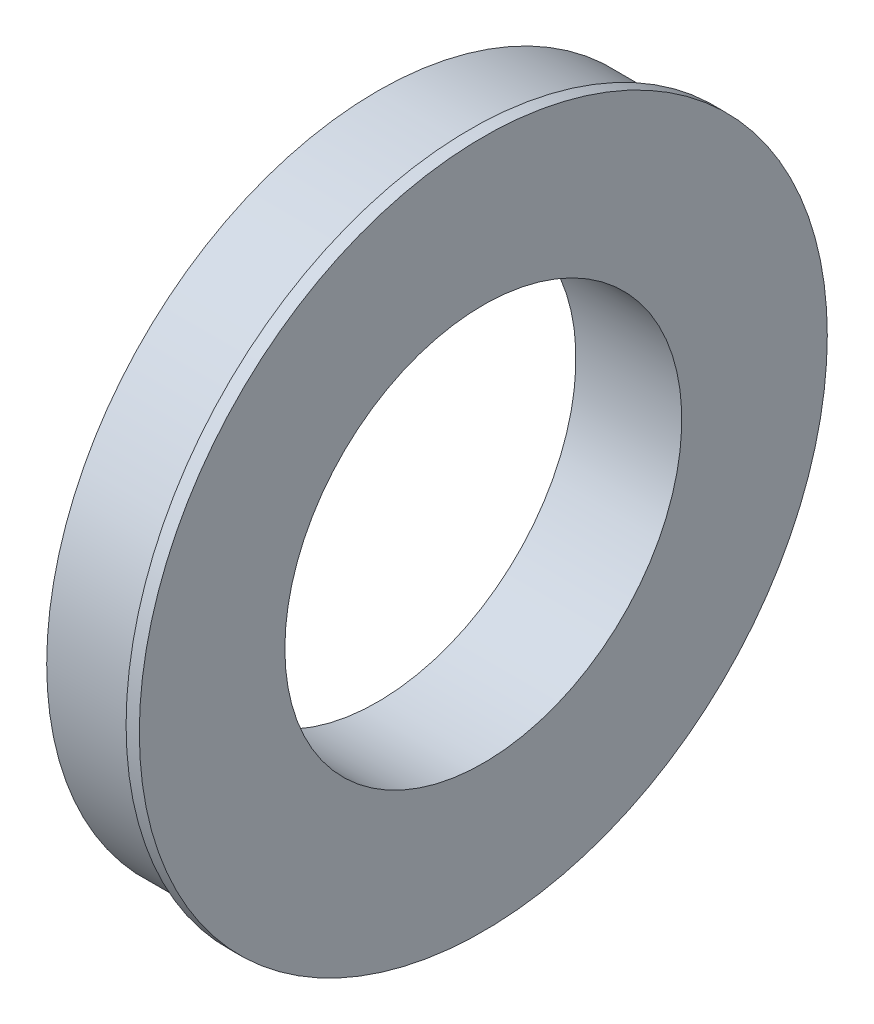
ISO-10303-21;
HEADER;
FILE_DESCRIPTION(('STEP AP214'),'2;1');
FILE_NAME('part.step','',(''),(''),'','','');
FILE_SCHEMA(('AUTOMOTIVE_DESIGN { 1 0 10303 214 1 1 1 1 }'));
ENDSEC;
DATA;
#1=APPLICATION_CONTEXT('core data for automotive mechanical design processes');
#2=APPLICATION_PROTOCOL_DEFINITION('international standard','automotive_design',2000,#1);
#3=PRODUCT_CONTEXT('',#1,'mechanical');
#4=PRODUCT('Part','Part','',(#3));
#5=PRODUCT_RELATED_PRODUCT_CATEGORY('part','',(#4));
#6=PRODUCT_DEFINITION_FORMATION('','',#4);
#7=PRODUCT_DEFINITION_CONTEXT('part definition',#1,'design');
#8=PRODUCT_DEFINITION('design','',#6,#7);
#9=PRODUCT_DEFINITION_SHAPE('','',#8);
#10=(LENGTH_UNIT() NAMED_UNIT(*) SI_UNIT(.MILLI.,.METRE.));
#11=(NAMED_UNIT(*) PLANE_ANGLE_UNIT() SI_UNIT($,.RADIAN.));
#12=(NAMED_UNIT(*) SI_UNIT($,.STERADIAN.) SOLID_ANGLE_UNIT());
#13=UNCERTAINTY_MEASURE_WITH_UNIT(LENGTH_MEASURE(1.E-05),#10,'distance_accuracy_value','');
#14=(GEOMETRIC_REPRESENTATION_CONTEXT(3) GLOBAL_UNCERTAINTY_ASSIGNED_CONTEXT((#13)) GLOBAL_UNIT_ASSIGNED_CONTEXT((#10,
#11,#12)) REPRESENTATION_CONTEXT('',''));
#15=CARTESIAN_POINT('',(0.,0.,0.));
#16=DIRECTION('',(0.,0.,1.));
#17=DIRECTION('',(1.,0.,0.));
#18=AXIS2_PLACEMENT_3D('',#15,#16,#17);
#19=CARTESIAN_POINT('',(9.525,0.,0.));
#20=DIRECTION('',(-1.,0.,0.));
#21=DIRECTION('',(0.,0.,1.));
#22=AXIS2_PLACEMENT_3D('',#19,#20,#21);
#23=CYLINDRICAL_SURFACE('',#22,63.5);
#24=CARTESIAN_POINT('',(-9.525,0.,0.));
#25=DIRECTION('',(1.,0.,0.));
#26=DIRECTION('',(0.,0.,-1.));
#27=AXIS2_PLACEMENT_3D('',#24,#25,#26);
#28=CIRCLE('',#27,63.5);
#29=CARTESIAN_POINT('',(-9.525,0.,63.5));
#30=VERTEX_POINT('',#29);
#31=EDGE_CURVE('E43',#30,#30,#28,.T.);
#32=CARTESIAN_POINT('',(8.255,0.,0.));
#33=DIRECTION('',(1.,0.,0.));
#34=DIRECTION('',(0.,0.,-1.));
#35=AXIS2_PLACEMENT_3D('',#32,#33,#34);
#36=CIRCLE('',#35,63.5);
#37=CARTESIAN_POINT('',(8.255,0.,63.5));
#38=VERTEX_POINT('',#37);
#39=EDGE_CURVE('E10',#38,#38,#36,.T.);
#40=CARTESIAN_POINT('',(-9.525,0.,63.5));
#41=CARTESIAN_POINT('',(-9.33979166666667,0.,63.5));
#42=CARTESIAN_POINT('',(-9.15458333333333,0.,63.5));
#43=CARTESIAN_POINT('',(-8.78416666666667,0.,63.5));
#44=CARTESIAN_POINT('',(-8.59895833333333,0.,63.5));
#45=CARTESIAN_POINT('',(-8.22854166666666,0.,63.5));
#46=CARTESIAN_POINT('',(-8.04333333333333,0.,63.5));
#47=CARTESIAN_POINT('',(-7.67291666666667,0.,63.5));
#48=CARTESIAN_POINT('',(-7.48770833333333,0.,63.5));
#49=CARTESIAN_POINT('',(-7.11729166666667,0.,63.5));
#50=CARTESIAN_POINT('',(-6.93208333333333,0.,63.5));
#51=CARTESIAN_POINT('',(-6.56166666666667,0.,63.5));
#52=CARTESIAN_POINT('',(-6.37645833333333,0.,63.5));
#53=CARTESIAN_POINT('',(-6.00604166666667,0.,63.5));
#54=CARTESIAN_POINT('',(-5.82083333333333,0.,63.5));
#55=CARTESIAN_POINT('',(-5.45041666666667,0.,63.5));
#56=CARTESIAN_POINT('',(-5.26520833333333,0.,63.5));
#57=CARTESIAN_POINT('',(-4.89479166666667,0.,63.5));
#58=CARTESIAN_POINT('',(-4.70958333333333,0.,63.5));
#59=CARTESIAN_POINT('',(-4.33916666666667,0.,63.5));
#60=CARTESIAN_POINT('',(-4.15395833333333,0.,63.5));
#61=CARTESIAN_POINT('',(-3.78354166666667,0.,63.5));
#62=CARTESIAN_POINT('',(-3.59833333333333,0.,63.5));
#63=CARTESIAN_POINT('',(-3.22791666666667,0.,63.5));
#64=CARTESIAN_POINT('',(-3.04270833333333,0.,63.5));
#65=CARTESIAN_POINT('',(-2.67229166666667,0.,63.5));
#66=CARTESIAN_POINT('',(-2.48708333333333,0.,63.5));
#67=CARTESIAN_POINT('',(-2.11666666666667,0.,63.5));
#68=CARTESIAN_POINT('',(-1.93145833333333,0.,63.5));
#69=CARTESIAN_POINT('',(-1.56104166666667,0.,63.5));
#70=CARTESIAN_POINT('',(-1.37583333333333,0.,63.5));
#71=CARTESIAN_POINT('',(-1.00541666666667,0.,63.5));
#72=CARTESIAN_POINT('',(-0.820208333333334,0.,63.5));
#73=CARTESIAN_POINT('',(-0.449791666666667,0.,63.5));
#74=CARTESIAN_POINT('',(-0.264583333333333,0.,63.5));
#75=CARTESIAN_POINT('',(0.105833333333334,0.,63.5));
#76=CARTESIAN_POINT('',(0.291041666666667,0.,63.5));
#77=CARTESIAN_POINT('',(0.661458333333334,0.,63.5));
#78=CARTESIAN_POINT('',(0.846666666666667,0.,63.5));
#79=CARTESIAN_POINT('',(1.21708333333333,0.,63.5));
#80=CARTESIAN_POINT('',(1.40229166666667,0.,63.5));
#81=CARTESIAN_POINT('',(1.77270833333333,0.,63.5));
#82=CARTESIAN_POINT('',(1.95791666666667,0.,63.5));
#83=CARTESIAN_POINT('',(2.32833333333333,0.,63.5));
#84=CARTESIAN_POINT('',(2.51354166666667,0.,63.5));
#85=CARTESIAN_POINT('',(2.88395833333333,0.,63.5));
#86=CARTESIAN_POINT('',(3.06916666666667,0.,63.5));
#87=CARTESIAN_POINT('',(3.43958333333333,0.,63.5));
#88=CARTESIAN_POINT('',(3.62479166666667,0.,63.5));
#89=CARTESIAN_POINT('',(3.99520833333333,0.,63.5));
#90=CARTESIAN_POINT('',(4.18041666666667,0.,63.5));
#91=CARTESIAN_POINT('',(4.55083333333333,0.,63.5));
#92=CARTESIAN_POINT('',(4.73604166666667,0.,63.5));
#93=CARTESIAN_POINT('',(5.10645833333333,0.,63.5));
#94=CARTESIAN_POINT('',(5.29166666666667,0.,63.5));
#95=CARTESIAN_POINT('',(5.66208333333333,0.,63.5));
#96=CARTESIAN_POINT('',(5.84729166666667,0.,63.5));
#97=CARTESIAN_POINT('',(6.21770833333333,0.,63.5));
#98=CARTESIAN_POINT('',(6.40291666666667,0.,63.5));
#99=CARTESIAN_POINT('',(6.77333333333333,0.,63.5));
#100=CARTESIAN_POINT('',(6.95854166666667,0.,63.5));
#101=CARTESIAN_POINT('',(7.32895833333333,0.,63.5));
#102=CARTESIAN_POINT('',(7.51416666666667,0.,63.5));
#103=CARTESIAN_POINT('',(7.88458333333333,0.,63.5));
#104=CARTESIAN_POINT('',(8.06979166666667,0.,63.5));
#105=CARTESIAN_POINT('',(8.255,0.,63.5));
#106=B_SPLINE_CURVE_WITH_KNOTS('',3,(#40,#41,#42,#43,#44,#45,#46,#47,#48,#49,#50,#51,#52,#53,
#54,#55,#56,#57,#58,#59,#60,#61,#62,#63,#64,#65,#66,#67,#68,#69,#70,#71,#72,#73,#74,#75,#76,#77,
#78,#79,#80,#81,#82,#83,#84,#85,#86,#87,#88,#89,#90,#91,#92,#93,#94,#95,#96,#97,#98,#99,#100,
#101,#102,#103,#104,#105),.UNSPECIFIED.,.F.,.F.,(4,2,2,2,2,2,2,2,2,2,2,2,2,2,2,2,2,2,2,2,2,2,2,
2,2,2,2,2,2,2,2,2,4),(0.,0.555625000000001,1.11125,1.666875,2.2225,2.778125,3.33375,3.889375,
4.445,5.000625,5.55625,6.111875,6.6675,7.223125,7.77875,8.334375,8.89,9.445625,10.00125,
10.556875,11.1125,11.668125,12.22375,12.779375,13.335,13.890625,14.44625,15.001875,15.5575,
16.113125,16.66875,17.224375,17.78),.UNSPECIFIED.);
#107=EDGE_CURVE('BSEAM40',#30,#38,#106,.T.);
#108=ORIENTED_EDGE('',*,*,#31,.T.);
#109=ORIENTED_EDGE('',*,*,#39,.F.);
#110=ORIENTED_EDGE('',*,*,#107,.T.);
#111=ORIENTED_EDGE('',*,*,#107,.F.);
#112=EDGE_LOOP('',(#108,#110,#109,#111));
#113=FACE_BOUND('',#112,.T.);
#114=ADVANCED_FACE('F40',(#113),#23,.T.);
#115=CARTESIAN_POINT('',(-9.525,0.,0.));
#116=DIRECTION('',(1.,0.,0.));
#117=DIRECTION('',(0.,0.,-1.));
#118=AXIS2_PLACEMENT_3D('',#115,#116,#117);
#119=PLANE('',#118);
#120=ORIENTED_EDGE('',*,*,#31,.F.);
#121=EDGE_LOOP('',(#120));
#122=FACE_BOUND('',#121,.T.);
#123=CARTESIAN_POINT('',(-9.525,0.,0.));
#124=DIRECTION('',(1.,0.,0.));
#125=DIRECTION('',(0.,0.,-1.));
#126=AXIS2_PLACEMENT_3D('',#123,#124,#125);
#127=CIRCLE('',#126,38.1);
#128=CARTESIAN_POINT('',(-9.525,0.,38.1));
#129=VERTEX_POINT('',#128);
#130=EDGE_CURVE('E53',#129,#129,#127,.T.);
#131=ORIENTED_EDGE('',*,*,#130,.T.);
#132=EDGE_LOOP('',(#131));
#133=FACE_BOUND('',#132,.T.);
#134=ADVANCED_FACE('F90',(#122,#133),#119,.F.);
#135=CARTESIAN_POINT('',(9.525,0.,0.));
#136=DIRECTION('',(-1.,0.,0.));
#137=DIRECTION('',(0.,0.,1.));
#138=AXIS2_PLACEMENT_3D('',#135,#136,#137);
#139=CYLINDRICAL_SURFACE('',#138,38.1);
#140=CARTESIAN_POINT('',(10.795,0.,0.));
#141=DIRECTION('',(1.,0.,0.));
#142=DIRECTION('',(0.,0.,-1.));
#143=AXIS2_PLACEMENT_3D('',#140,#141,#142);
#144=CIRCLE('',#143,38.1);
#145=CARTESIAN_POINT('',(10.795,0.,38.1));
#146=VERTEX_POINT('',#145);
#147=EDGE_CURVE('E68',#146,#146,#144,.T.);
#148=CARTESIAN_POINT('',(-9.525,0.,38.1));
#149=CARTESIAN_POINT('',(-9.31333333333333,0.,38.1));
#150=CARTESIAN_POINT('',(-9.10166666666667,0.,38.1));
#151=CARTESIAN_POINT('',(-8.67833333333333,0.,38.1));
#152=CARTESIAN_POINT('',(-8.46666666666667,0.,38.1));
#153=CARTESIAN_POINT('',(-8.04333333333333,0.,38.1));
#154=CARTESIAN_POINT('',(-7.83166666666667,0.,38.1));
#155=CARTESIAN_POINT('',(-7.40833333333333,0.,38.1));
#156=CARTESIAN_POINT('',(-7.19666666666667,0.,38.1));
#157=CARTESIAN_POINT('',(-6.77333333333333,0.,38.1));
#158=CARTESIAN_POINT('',(-6.56166666666667,0.,38.1));
#159=CARTESIAN_POINT('',(-6.13833333333333,0.,38.1));
#160=CARTESIAN_POINT('',(-5.92666666666667,0.,38.1));
#161=CARTESIAN_POINT('',(-5.50333333333333,0.,38.1));
#162=CARTESIAN_POINT('',(-5.29166666666667,0.,38.1));
#163=CARTESIAN_POINT('',(-4.86833333333333,0.,38.1));
#164=CARTESIAN_POINT('',(-4.65666666666667,0.,38.1));
#165=CARTESIAN_POINT('',(-4.23333333333333,0.,38.1));
#166=CARTESIAN_POINT('',(-4.02166666666667,0.,38.1));
#167=CARTESIAN_POINT('',(-3.59833333333333,0.,38.1));
#168=CARTESIAN_POINT('',(-3.38666666666667,0.,38.1));
#169=CARTESIAN_POINT('',(-2.96333333333333,0.,38.1));
#170=CARTESIAN_POINT('',(-2.75166666666667,0.,38.1));
#171=CARTESIAN_POINT('',(-2.32833333333333,0.,38.1));
#172=CARTESIAN_POINT('',(-2.11666666666667,0.,38.1));
#173=CARTESIAN_POINT('',(-1.69333333333333,0.,38.1));
#174=CARTESIAN_POINT('',(-1.48166666666667,0.,38.1));
#175=CARTESIAN_POINT('',(-1.05833333333333,0.,38.1));
#176=CARTESIAN_POINT('',(-0.846666666666667,0.,38.1));
#177=CARTESIAN_POINT('',(-0.423333333333333,0.,38.1));
#178=CARTESIAN_POINT('',(-0.211666666666667,0.,38.1));
#179=CARTESIAN_POINT('',(0.211666666666667,0.,38.1));
#180=CARTESIAN_POINT('',(0.423333333333333,0.,38.1));
#181=CARTESIAN_POINT('',(0.846666666666667,0.,38.1));
#182=CARTESIAN_POINT('',(1.05833333333333,0.,38.1));
#183=CARTESIAN_POINT('',(1.48166666666667,0.,38.1));
#184=CARTESIAN_POINT('',(1.69333333333333,0.,38.1));
#185=CARTESIAN_POINT('',(2.11666666666667,0.,38.1));
#186=CARTESIAN_POINT('',(2.32833333333333,0.,38.1));
#187=CARTESIAN_POINT('',(2.75166666666667,0.,38.1));
#188=CARTESIAN_POINT('',(2.96333333333333,0.,38.1));
#189=CARTESIAN_POINT('',(3.38666666666667,0.,38.1));
#190=CARTESIAN_POINT('',(3.59833333333333,0.,38.1));
#191=CARTESIAN_POINT('',(4.02166666666667,0.,38.1));
#192=CARTESIAN_POINT('',(4.23333333333333,0.,38.1));
#193=CARTESIAN_POINT('',(4.65666666666667,0.,38.1));
#194=CARTESIAN_POINT('',(4.86833333333333,0.,38.1));
#195=CARTESIAN_POINT('',(5.29166666666667,0.,38.1));
#196=CARTESIAN_POINT('',(5.50333333333333,0.,38.1));
#197=CARTESIAN_POINT('',(5.92666666666667,0.,38.1));
#198=CARTESIAN_POINT('',(6.13833333333333,0.,38.1));
#199=CARTESIAN_POINT('',(6.56166666666667,0.,38.1));
#200=CARTESIAN_POINT('',(6.77333333333333,0.,38.1));
#201=CARTESIAN_POINT('',(7.19666666666667,0.,38.1));
#202=CARTESIAN_POINT('',(7.40833333333333,0.,38.1));
#203=CARTESIAN_POINT('',(7.83166666666667,0.,38.1));
#204=CARTESIAN_POINT('',(8.04333333333333,0.,38.1));
#205=CARTESIAN_POINT('',(8.46666666666667,0.,38.1));
#206=CARTESIAN_POINT('',(8.67833333333333,0.,38.1));
#207=CARTESIAN_POINT('',(9.10166666666667,0.,38.1));
#208=CARTESIAN_POINT('',(9.31333333333333,0.,38.1));
#209=CARTESIAN_POINT('',(9.73666666666667,0.,38.1));
#210=CARTESIAN_POINT('',(9.94833333333333,0.,38.1));
#211=CARTESIAN_POINT('',(10.3716666666667,0.,38.1));
#212=CARTESIAN_POINT('',(10.5833333333333,0.,38.1));
#213=CARTESIAN_POINT('',(10.795,0.,38.1));
#214=B_SPLINE_CURVE_WITH_KNOTS('',3,(#148,#149,#150,#151,#152,#153,#154,#155,#156,#157,#158,
#159,#160,#161,#162,#163,#164,#165,#166,#167,#168,#169,#170,#171,#172,#173,#174,#175,#176,#177,
#178,#179,#180,#181,#182,#183,#184,#185,#186,#187,#188,#189,#190,#191,#192,#193,#194,#195,#196,
#197,#198,#199,#200,#201,#202,#203,#204,#205,#206,#207,#208,#209,#210,#211,#212,#213),
.UNSPECIFIED.,.F.,.F.,(4,2,2,2,2,2,2,2,2,2,2,2,2,2,2,2,2,2,2,2,2,2,2,2,2,2,2,2,2,2,2,2,4),(0.,
0.635,1.27,1.905,2.54,3.175,3.81,4.445,5.08,5.715,6.35,6.985,7.62,8.255,8.89,9.525,10.16,10.795,
11.43,12.065,12.7,13.335,13.97,14.605,15.24,15.875,16.51,17.145,17.78,18.415,19.05,19.685,
20.32),.UNSPECIFIED.);
#215=EDGE_CURVE('BSEAM74',#129,#146,#214,.T.);
#216=ORIENTED_EDGE('',*,*,#130,.F.);
#217=ORIENTED_EDGE('',*,*,#147,.T.);
#218=ORIENTED_EDGE('',*,*,#215,.T.);
#219=ORIENTED_EDGE('',*,*,#215,.F.);
#220=EDGE_LOOP('',(#216,#218,#217,#219));
#221=FACE_BOUND('',#220,.T.);
#222=ADVANCED_FACE('F74',(#221),#139,.F.);
#223=CARTESIAN_POINT('',(8.255,0.,0.));
#224=DIRECTION('',(1.,0.,0.));
#225=DIRECTION('',(0.,0.,-1.));
#226=AXIS2_PLACEMENT_3D('',#223,#224,#225);
#227=PLANE('',#226);
#228=CARTESIAN_POINT('',(8.255,0.,0.));
#229=DIRECTION('',(1.,0.,0.));
#230=DIRECTION('',(0.,0.,-1.));
#231=AXIS2_PLACEMENT_3D('',#228,#229,#230);
#232=CIRCLE('',#231,66.04);
#233=CARTESIAN_POINT('',(8.255,0.,-66.04));
#234=VERTEX_POINT('',#233);
#235=EDGE_CURVE('E55',#234,#234,#232,.T.);
#236=ORIENTED_EDGE('',*,*,#235,.F.);
#237=EDGE_LOOP('',(#236));
#238=FACE_BOUND('',#237,.T.);
#239=ORIENTED_EDGE('',*,*,#39,.T.);
#240=EDGE_LOOP('',(#239));
#241=FACE_BOUND('',#240,.T.);
#242=ADVANCED_FACE('F79',(#238,#241),#227,.F.);
#243=CARTESIAN_POINT('',(10.795,0.,0.));
#244=DIRECTION('',(1.,0.,0.));
#245=DIRECTION('',(0.,0.,-1.));
#246=AXIS2_PLACEMENT_3D('',#243,#244,#245);
#247=PLANE('',#246);
#248=CARTESIAN_POINT('',(10.795,0.,0.));
#249=DIRECTION('',(1.,0.,0.));
#250=DIRECTION('',(0.,0.,-1.));
#251=AXIS2_PLACEMENT_3D('',#248,#249,#250);
#252=CIRCLE('',#251,66.04);
#253=CARTESIAN_POINT('',(10.795,0.,-66.04));
#254=VERTEX_POINT('',#253);
#255=EDGE_CURVE('E59',#254,#254,#252,.T.);
#256=ORIENTED_EDGE('',*,*,#255,.T.);
#257=EDGE_LOOP('',(#256));
#258=FACE_BOUND('',#257,.T.);
#259=ORIENTED_EDGE('',*,*,#147,.F.);
#260=EDGE_LOOP('',(#259));
#261=FACE_BOUND('',#260,.T.);
#262=ADVANCED_FACE('F76',(#258,#261),#247,.T.);
#263=CARTESIAN_POINT('',(10.795,0.,0.));
#264=DIRECTION('',(-1.,0.,0.));
#265=DIRECTION('',(0.,0.,1.));
#266=AXIS2_PLACEMENT_3D('',#263,#264,#265);
#267=CYLINDRICAL_SURFACE('',#266,66.04);
#268=ORIENTED_EDGE('',*,*,#255,.F.);
#269=EDGE_LOOP('',(#268));
#270=FACE_BOUND('',#269,.T.);
#271=ORIENTED_EDGE('',*,*,#235,.T.);
#272=EDGE_LOOP('',(#271));
#273=FACE_BOUND('',#272,.T.);
#274=ADVANCED_FACE('F78',(#270,#273),#267,.T.);
#275=CLOSED_SHELL('',(#114,#134,#222,#242,#262,#274));
#276=MANIFOLD_SOLID_BREP('B2',#275);
#277=ADVANCED_BREP_SHAPE_REPRESENTATION('',(#18,#276),#14);
#278=SHAPE_DEFINITION_REPRESENTATION(#9,#277);
ENDSEC;
END-ISO-10303-21;
